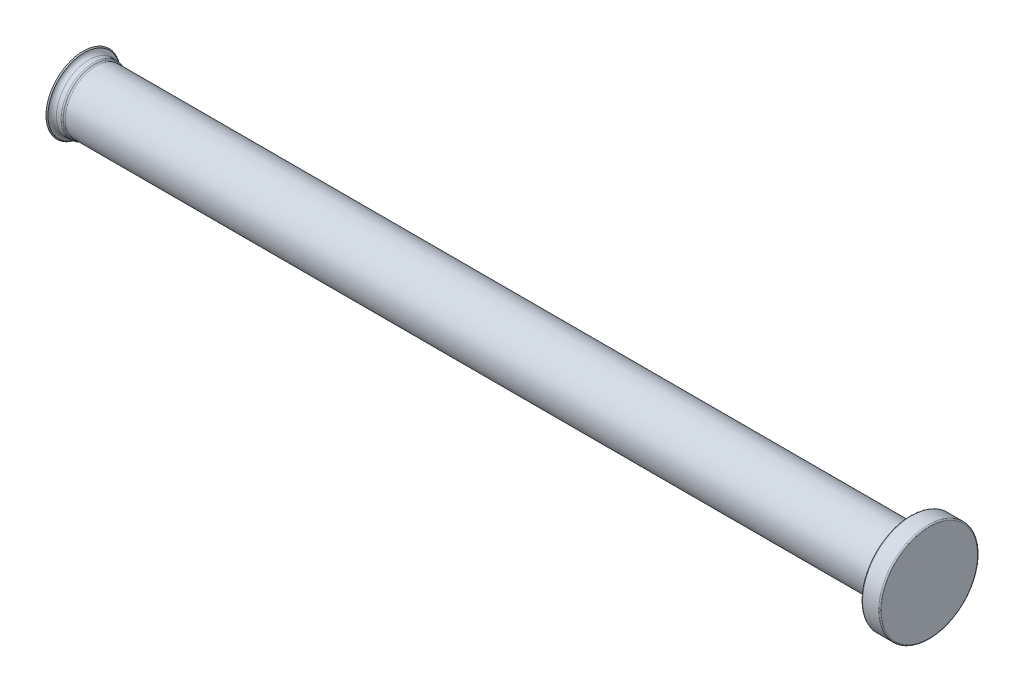
ISO-10303-21;
HEADER;
FILE_DESCRIPTION(('STEP AP214'),'2;1');
FILE_NAME('part.step','',(''),(''),'','','');
FILE_SCHEMA(('AUTOMOTIVE_DESIGN { 1 0 10303 214 1 1 1 1 }'));
ENDSEC;
DATA;
#1=APPLICATION_CONTEXT('core data for automotive mechanical design processes');
#2=APPLICATION_PROTOCOL_DEFINITION('international standard','automotive_design',2000,#1);
#3=PRODUCT_CONTEXT('',#1,'mechanical');
#4=PRODUCT('Part','Part','',(#3));
#5=PRODUCT_RELATED_PRODUCT_CATEGORY('part','',(#4));
#6=PRODUCT_DEFINITION_FORMATION('','',#4);
#7=PRODUCT_DEFINITION_CONTEXT('part definition',#1,'design');
#8=PRODUCT_DEFINITION('design','',#6,#7);
#9=PRODUCT_DEFINITION_SHAPE('','',#8);
#10=(LENGTH_UNIT() NAMED_UNIT(*) SI_UNIT(.MILLI.,.METRE.));
#11=(NAMED_UNIT(*) PLANE_ANGLE_UNIT() SI_UNIT($,.RADIAN.));
#12=(NAMED_UNIT(*) SI_UNIT($,.STERADIAN.) SOLID_ANGLE_UNIT());
#13=UNCERTAINTY_MEASURE_WITH_UNIT(LENGTH_MEASURE(1.E-05),#10,'distance_accuracy_value','');
#14=(GEOMETRIC_REPRESENTATION_CONTEXT(3) GLOBAL_UNCERTAINTY_ASSIGNED_CONTEXT((#13)) GLOBAL_UNIT_ASSIGNED_CONTEXT((#10,
#11,#12)) REPRESENTATION_CONTEXT('',''));
#15=CARTESIAN_POINT('',(0.,0.,0.));
#16=DIRECTION('',(0.,0.,1.));
#17=DIRECTION('',(1.,0.,0.));
#18=AXIS2_PLACEMENT_3D('',#15,#16,#17);
#19=CARTESIAN_POINT('',(-68.,0.,0.));
#20=DIRECTION('',(-1.,0.,0.));
#21=DIRECTION('',(0.,0.,1.));
#22=AXIS2_PLACEMENT_3D('',#19,#20,#21);
#23=TOROIDAL_SURFACE('',#22,3.02521947805027,0.52521947805027);
#24=CARTESIAN_POINT('',(-68.,0.,0.));
#25=DIRECTION('',(-1.,0.,0.));
#26=DIRECTION('',(0.,0.,1.));
#27=AXIS2_PLACEMENT_3D('',#24,#25,#26);
#28=CIRCLE('',#27,2.5);
#29=CARTESIAN_POINT('',(-68.,0.,2.5));
#30=VERTEX_POINT('',#29);
#31=EDGE_CURVE('E80',#30,#30,#28,.T.);
#32=ORIENTED_EDGE('',*,*,#31,.F.);
#33=EDGE_LOOP('',(#32));
#34=FACE_BOUND('',#33,.T.);
#35=CARTESIAN_POINT('',(-68.5081443533099,0.,0.));
#36=DIRECTION('',(-1.,0.,0.));
#37=DIRECTION('',(0.,0.,1.));
#38=AXIS2_PLACEMENT_3D('',#35,#36,#37);
#39=CIRCLE('',#38,2.89238568595394);
#40=CARTESIAN_POINT('',(-68.5081443533099,0.,2.89238568595394));
#41=VERTEX_POINT('',#40);
#42=EDGE_CURVE('E11',#41,#41,#39,.T.);
#43=ORIENTED_EDGE('',*,*,#42,.T.);
#44=EDGE_LOOP('',(#43));
#45=FACE_BOUND('',#44,.T.);
#46=ADVANCED_FACE('F43',(#34,#45),#23,.T.);
#47=CARTESIAN_POINT('',(-68.4715621559245,0.,0.));
#48=DIRECTION('',(1.,0.,0.));
#49=DIRECTION('',(0.,0.,-1.));
#50=AXIS2_PLACEMENT_3D('',#47,#48,#49);
#51=CONICAL_SURFACE('',#50,3.,1.24311337407207);
#52=ORIENTED_EDGE('',*,*,#42,.F.);
#53=EDGE_LOOP('',(#52));
#54=FACE_BOUND('',#53,.T.);
#55=CARTESIAN_POINT('',(-68.4715621559245,0.,0.));
#56=DIRECTION('',(-1.,0.,0.));
#57=DIRECTION('',(0.,0.,1.));
#58=AXIS2_PLACEMENT_3D('',#55,#56,#57);
#59=CIRCLE('',#58,3.);
#60=CARTESIAN_POINT('',(-68.4715621559245,0.,3.));
#61=VERTEX_POINT('',#60);
#62=EDGE_CURVE('E49',#61,#61,#59,.T.);
#63=ORIENTED_EDGE('',*,*,#62,.T.);
#64=EDGE_LOOP('',(#63));
#65=FACE_BOUND('',#64,.T.);
#66=ADVANCED_FACE('F87',(#54,#65),#51,.T.);
#67=CARTESIAN_POINT('',(-68.3869958175932,0.,0.));
#68=DIRECTION('',(-1.,0.,0.));
#69=DIRECTION('',(0.,0.,1.));
#70=AXIS2_PLACEMENT_3D('',#67,#68,#69);
#71=CONICAL_SURFACE('',#70,2.92405507143729,0.731737549159094);
#72=ORIENTED_EDGE('',*,*,#62,.F.);
#73=EDGE_LOOP('',(#72));
#74=FACE_BOUND('',#73,.T.);
#75=CARTESIAN_POINT('',(-68.3869958175932,0.,0.));
#76=DIRECTION('',(-1.,0.,0.));
#77=DIRECTION('',(0.,0.,1.));
#78=AXIS2_PLACEMENT_3D('',#75,#76,#77);
#79=CIRCLE('',#78,2.92405507143729);
#80=CARTESIAN_POINT('',(-68.3869958175932,0.,2.92405507143729));
#81=VERTEX_POINT('',#80);
#82=EDGE_CURVE('E53',#81,#81,#79,.T.);
#83=ORIENTED_EDGE('',*,*,#82,.T.);
#84=EDGE_LOOP('',(#83));
#85=FACE_BOUND('',#84,.T.);
#86=ADVANCED_FACE('F91',(#74,#85),#71,.T.);
#87=CARTESIAN_POINT('',(-68.,0.,0.));
#88=DIRECTION('',(-1.,0.,0.));
#89=DIRECTION('',(0.,0.,1.));
#90=AXIS2_PLACEMENT_3D('',#87,#88,#89);
#91=TOROIDAL_SURFACE('',#90,3.02521947805027,0.399999999999998);
#92=ORIENTED_EDGE('',*,*,#82,.F.);
#93=EDGE_LOOP('',(#92));
#94=FACE_BOUND('',#93,.T.);
#95=CARTESIAN_POINT('',(-68.,0.,0.));
#96=DIRECTION('',(-1.,0.,0.));
#97=DIRECTION('',(0.,0.,1.));
#98=AXIS2_PLACEMENT_3D('',#95,#96,#97);
#99=CIRCLE('',#98,2.62521947805027);
#100=CARTESIAN_POINT('',(-68.,0.,2.62521947805027));
#101=VERTEX_POINT('',#100);
#102=EDGE_CURVE('E57',#101,#101,#99,.T.);
#103=ORIENTED_EDGE('',*,*,#102,.T.);
#104=EDGE_LOOP('',(#103));
#105=FACE_BOUND('',#104,.T.);
#106=ADVANCED_FACE('F96',(#94,#105),#91,.F.);
#107=CARTESIAN_POINT('',(-67.5,0.,0.));
#108=DIRECTION('',(-1.,0.,0.));
#109=DIRECTION('',(0.,0.,1.));
#110=AXIS2_PLACEMENT_3D('',#107,#108,#109);
#111=CYLINDRICAL_SURFACE('',#110,2.62521947805027);
#112=ORIENTED_EDGE('',*,*,#102,.F.);
#113=EDGE_LOOP('',(#112));
#114=FACE_BOUND('',#113,.T.);
#115=CARTESIAN_POINT('',(-67.6252194666853,0.,0.));
#116=DIRECTION('',(-1.,0.,0.));
#117=DIRECTION('',(0.,0.,1.));
#118=AXIS2_PLACEMENT_3D('',#115,#116,#117);
#119=CIRCLE('',#118,2.62521947805027);
#120=CARTESIAN_POINT('',(-67.6252194666853,0.,2.62521947805027));
#121=VERTEX_POINT('',#120);
#122=EDGE_CURVE('E62',#121,#121,#119,.T.);
#123=ORIENTED_EDGE('',*,*,#122,.T.);
#124=EDGE_LOOP('',(#123));
#125=FACE_BOUND('',#124,.T.);
#126=ADVANCED_FACE('F102',(#114,#125),#111,.T.);
#127=CARTESIAN_POINT('',(-67.6252194666853,0.,0.));
#128=DIRECTION('',(-1.,0.,0.));
#129=DIRECTION('',(0.,0.,1.));
#130=AXIS2_PLACEMENT_3D('',#127,#128,#129);
#131=TOROIDAL_SURFACE('',#130,2.50000001136495,0.125219466685321);
#132=ORIENTED_EDGE('',*,*,#122,.F.);
#133=EDGE_LOOP('',(#132));
#134=FACE_BOUND('',#133,.T.);
#135=CARTESIAN_POINT('',(-67.5167762242067,0.,0.));
#136=DIRECTION('',(-1.,0.,0.));
#137=DIRECTION('',(0.,0.,1.));
#138=AXIS2_PLACEMENT_3D('',#135,#136,#137);
#139=CIRCLE('',#138,2.56260973902513);
#140=CARTESIAN_POINT('',(-67.5167762242067,0.,2.56260973902513));
#141=VERTEX_POINT('',#140);
#142=EDGE_CURVE('E65',#141,#141,#139,.T.);
#143=ORIENTED_EDGE('',*,*,#142,.T.);
#144=EDGE_LOOP('',(#143));
#145=FACE_BOUND('',#144,.T.);
#146=ADVANCED_FACE('F106',(#134,#145),#131,.T.);
#147=CARTESIAN_POINT('',(-67.4083329817281,0.,0.));
#148=DIRECTION('',(-1.,0.,0.));
#149=DIRECTION('',(0.,0.,1.));
#150=AXIS2_PLACEMENT_3D('',#147,#148,#149);
#151=TOROIDAL_SURFACE('',#150,2.62521946668532,0.125219466685323);
#152=ORIENTED_EDGE('',*,*,#142,.F.);
#153=EDGE_LOOP('',(#152));
#154=FACE_BOUND('',#153,.T.);
#155=CARTESIAN_POINT('',(-67.4083329817281,0.,0.));
#156=DIRECTION('',(-1.,0.,0.));
#157=DIRECTION('',(0.,0.,1.));
#158=AXIS2_PLACEMENT_3D('',#155,#156,#157);
#159=CIRCLE('',#158,2.5);
#160=CARTESIAN_POINT('',(-67.4083329817281,0.,2.5));
#161=VERTEX_POINT('',#160);
#162=EDGE_CURVE('E68',#161,#161,#159,.T.);
#163=ORIENTED_EDGE('',*,*,#162,.T.);
#164=EDGE_LOOP('',(#163));
#165=FACE_BOUND('',#164,.T.);
#166=ADVANCED_FACE('F110',(#154,#165),#151,.F.);
#167=CARTESIAN_POINT('',(-67.4083329817281,2.5,0.));
#168=DIRECTION('',(-1.,0.,0.));
#169=DIRECTION('',(0.,0.,1.));
#170=AXIS2_PLACEMENT_3D('',#167,#168,#169);
#171=PLANE('',#170);
#172=ORIENTED_EDGE('',*,*,#162,.F.);
#173=EDGE_LOOP('',(#172));
#174=FACE_BOUND('',#173,.T.);
#175=CARTESIAN_POINT('',(-67.4083329817281,0.,0.));
#176=DIRECTION('',(-1.,0.,0.));
#177=DIRECTION('',(0.,0.,1.));
#178=AXIS2_PLACEMENT_3D('',#175,#176,#177);
#179=CIRCLE('',#178,2.00059573308664);
#180=CARTESIAN_POINT('',(-67.4083329817281,0.,2.00059573308664));
#181=VERTEX_POINT('',#180);
#182=EDGE_CURVE('E71',#181,#181,#179,.T.);
#183=ORIENTED_EDGE('',*,*,#182,.T.);
#184=EDGE_LOOP('',(#183));
#185=FACE_BOUND('',#184,.T.);
#186=ADVANCED_FACE('F114',(#174,#185),#171,.F.);
#187=CARTESIAN_POINT('',(-67.5,0.,0.));
#188=DIRECTION('',(-1.,0.,0.));
#189=DIRECTION('',(0.,0.,1.));
#190=AXIS2_PLACEMENT_3D('',#187,#188,#189);
#191=CONICAL_SURFACE('',#190,2.40261795055891,1.34661420724191);
#192=ORIENTED_EDGE('',*,*,#182,.F.);
#193=EDGE_LOOP('',(#192));
#194=FACE_BOUND('',#193,.T.);
#195=CARTESIAN_POINT('',(-67.5,0.,0.));
#196=DIRECTION('',(-1.,0.,0.));
#197=DIRECTION('',(0.,0.,1.));
#198=AXIS2_PLACEMENT_3D('',#195,#196,#197);
#199=CIRCLE('',#198,2.40261795055891);
#200=CARTESIAN_POINT('',(-67.5,0.,2.40261795055891));
#201=VERTEX_POINT('',#200);
#202=EDGE_CURVE('E74',#201,#201,#199,.T.);
#203=ORIENTED_EDGE('',*,*,#202,.T.);
#204=EDGE_LOOP('',(#203));
#205=FACE_BOUND('',#204,.T.);
#206=ADVANCED_FACE('F118',(#194,#205),#191,.F.);
#207=CARTESIAN_POINT('',(-67.6220860067253,0.,0.));
#208=DIRECTION('',(-1.,0.,0.));
#209=DIRECTION('',(0.,0.,1.));
#210=AXIS2_PLACEMENT_3D('',#207,#208,#209);
#211=TOROIDAL_SURFACE('',#210,2.37478053331467,0.125219466685326);
#212=ORIENTED_EDGE('',*,*,#202,.F.);
#213=EDGE_LOOP('',(#212));
#214=FACE_BOUND('',#213,.T.);
#215=CARTESIAN_POINT('',(-67.6220860067253,0.,0.));
#216=DIRECTION('',(-1.,0.,0.));
#217=DIRECTION('',(0.,0.,1.));
#218=AXIS2_PLACEMENT_3D('',#215,#216,#217);
#219=CIRCLE('',#218,2.5);
#220=CARTESIAN_POINT('',(-67.6220860067253,0.,2.5));
#221=VERTEX_POINT('',#220);
#222=EDGE_CURVE('E77',#221,#221,#219,.T.);
#223=ORIENTED_EDGE('',*,*,#222,.T.);
#224=EDGE_LOOP('',(#223));
#225=FACE_BOUND('',#224,.T.);
#226=ADVANCED_FACE('F122',(#214,#225),#211,.F.);
#227=CARTESIAN_POINT('',(-67.5,0.,0.));
#228=DIRECTION('',(-1.,0.,0.));
#229=DIRECTION('',(0.,0.,1.));
#230=AXIS2_PLACEMENT_3D('',#227,#228,#229);
#231=CYLINDRICAL_SURFACE('',#230,2.5);
#232=ORIENTED_EDGE('',*,*,#222,.F.);
#233=EDGE_LOOP('',(#232));
#234=FACE_BOUND('',#233,.T.);
#235=ORIENTED_EDGE('',*,*,#31,.T.);
#236=EDGE_LOOP('',(#235));
#237=FACE_BOUND('',#236,.T.);
#238=ADVANCED_FACE('F84',(#234,#237),#231,.F.);
#239=CLOSED_SHELL('',(#46,#66,#86,#106,#126,#146,#166,#186,#206,#226,#238));
#240=MANIFOLD_SOLID_BREP('B2',#239);
#241=CARTESIAN_POINT('',(0.,0.,0.));
#242=DIRECTION('',(-1.,0.,0.));
#243=DIRECTION('',(0.,0.,1.));
#244=AXIS2_PLACEMENT_3D('',#241,#242,#243);
#245=PLANE('',#244);
#246=CARTESIAN_POINT('',(0.,0.,0.));
#247=DIRECTION('',(-1.,0.,0.));
#248=DIRECTION('',(0.,0.,1.));
#249=AXIS2_PLACEMENT_3D('',#246,#247,#248);
#250=CIRCLE('',#249,3.9);
#251=CARTESIAN_POINT('',(0.,0.,3.9));
#252=VERTEX_POINT('',#251);
#253=EDGE_CURVE('E217',#252,#252,#250,.F.);
#254=ORIENTED_EDGE('',*,*,#253,.T.);
#255=EDGE_LOOP('',(#254));
#256=FACE_BOUND('',#255,.T.);
#257=ADVANCED_FACE('F210',(#256),#245,.F.);
#258=CARTESIAN_POINT('',(0.,0.,0.));
#259=DIRECTION('',(-1.,0.,0.));
#260=DIRECTION('',(0.,0.,1.));
#261=AXIS2_PLACEMENT_3D('',#258,#259,#260);
#262=CYLINDRICAL_SURFACE('',#261,4.);
#263=CARTESIAN_POINT('',(-0.1,0.,0.));
#264=DIRECTION('',(-1.,0.,0.));
#265=DIRECTION('',(0.,0.,1.));
#266=AXIS2_PLACEMENT_3D('',#263,#264,#265);
#267=CIRCLE('',#266,4.);
#268=CARTESIAN_POINT('',(-0.1,0.,4.));
#269=VERTEX_POINT('',#268);
#270=EDGE_CURVE('E236',#269,#269,#267,.T.);
#271=ORIENTED_EDGE('',*,*,#270,.T.);
#272=EDGE_LOOP('',(#271));
#273=FACE_BOUND('',#272,.T.);
#274=CARTESIAN_POINT('',(-1.4,0.,0.));
#275=DIRECTION('',(1.,0.,0.));
#276=DIRECTION('',(0.,0.,-1.));
#277=AXIS2_PLACEMENT_3D('',#274,#275,#276);
#278=CIRCLE('',#277,4.);
#279=CARTESIAN_POINT('',(-1.4,0.,-4.));
#280=VERTEX_POINT('',#279);
#281=EDGE_CURVE('E231',#280,#280,#278,.T.);
#282=ORIENTED_EDGE('',*,*,#281,.T.);
#283=EDGE_LOOP('',(#282));
#284=FACE_BOUND('',#283,.T.);
#285=ADVANCED_FACE('F248',(#273,#284),#262,.T.);
#286=CARTESIAN_POINT('',(-1.5,4.,0.));
#287=DIRECTION('',(1.,0.,0.));
#288=DIRECTION('',(0.,0.,-1.));
#289=AXIS2_PLACEMENT_3D('',#286,#287,#288);
#290=PLANE('',#289);
#291=CARTESIAN_POINT('',(-1.5,0.,0.));
#292=DIRECTION('',(1.,0.,0.));
#293=DIRECTION('',(0.,0.,-1.));
#294=AXIS2_PLACEMENT_3D('',#291,#292,#293);
#295=CIRCLE('',#294,3.9);
#296=CARTESIAN_POINT('',(-1.5,0.,-3.9));
#297=VERTEX_POINT('',#296);
#298=EDGE_CURVE('E41',#297,#297,#295,.F.);
#299=ORIENTED_EDGE('',*,*,#298,.T.);
#300=EDGE_LOOP('',(#299));
#301=FACE_BOUND('',#300,.T.);
#302=CARTESIAN_POINT('',(-1.5,0.,0.));
#303=DIRECTION('',(-1.,0.,0.));
#304=DIRECTION('',(0.,0.,1.));
#305=AXIS2_PLACEMENT_3D('',#302,#303,#304);
#306=CIRCLE('',#305,2.5);
#307=CARTESIAN_POINT('',(-1.5,0.,2.5));
#308=VERTEX_POINT('',#307);
#309=EDGE_CURVE('E228',#308,#308,#306,.T.);
#310=ORIENTED_EDGE('',*,*,#309,.F.);
#311=EDGE_LOOP('',(#310));
#312=FACE_BOUND('',#311,.T.);
#313=ADVANCED_FACE('F251',(#301,#312),#290,.F.);
#314=CARTESIAN_POINT('',(0.,0.,0.));
#315=DIRECTION('',(-1.,0.,0.));
#316=DIRECTION('',(0.,0.,1.));
#317=AXIS2_PLACEMENT_3D('',#314,#315,#316);
#318=CYLINDRICAL_SURFACE('',#317,2.5);
#319=CARTESIAN_POINT('',(-67.5,0.,0.));
#320=DIRECTION('',(-1.,0.,0.));
#321=DIRECTION('',(0.,0.,1.));
#322=AXIS2_PLACEMENT_3D('',#319,#320,#321);
#323=CIRCLE('',#322,2.49999999999999);
#324=CARTESIAN_POINT('',(-67.5,0.,2.49999999999999));
#325=VERTEX_POINT('',#324);
#326=EDGE_CURVE('E226',#325,#325,#323,.T.);
#327=ORIENTED_EDGE('',*,*,#326,.F.);
#328=EDGE_LOOP('',(#327));
#329=FACE_BOUND('',#328,.T.);
#330=ORIENTED_EDGE('',*,*,#309,.T.);
#331=EDGE_LOOP('',(#330));
#332=FACE_BOUND('',#331,.T.);
#333=ADVANCED_FACE('F245',(#329,#332),#318,.T.);
#334=CARTESIAN_POINT('',(-0.1,0.,0.));
#335=DIRECTION('',(-1.,0.,0.));
#336=DIRECTION('',(0.,0.,1.));
#337=AXIS2_PLACEMENT_3D('',#334,#335,#336);
#338=TOROIDAL_SURFACE('',#337,3.9,0.1);
#339=ORIENTED_EDGE('',*,*,#253,.F.);
#340=EDGE_LOOP('',(#339));
#341=FACE_BOUND('',#340,.T.);
#342=ORIENTED_EDGE('',*,*,#270,.F.);
#343=EDGE_LOOP('',(#342));
#344=FACE_BOUND('',#343,.T.);
#345=ADVANCED_FACE('F242',(#341,#344),#338,.T.);
#346=CARTESIAN_POINT('',(-1.4,0.,0.));
#347=DIRECTION('',(1.,0.,0.));
#348=DIRECTION('',(0.,0.,-1.));
#349=AXIS2_PLACEMENT_3D('',#346,#347,#348);
#350=TOROIDAL_SURFACE('',#349,3.9,0.1);
#351=ORIENTED_EDGE('',*,*,#281,.F.);
#352=EDGE_LOOP('',(#351));
#353=FACE_BOUND('',#352,.T.);
#354=ORIENTED_EDGE('',*,*,#298,.F.);
#355=EDGE_LOOP('',(#354));
#356=FACE_BOUND('',#355,.T.);
#357=ADVANCED_FACE('F212',(#353,#356),#350,.T.);
#358=CARTESIAN_POINT('',(-67.5,0.,0.));
#359=DIRECTION('',(-1.,0.,0.));
#360=DIRECTION('',(0.,0.,1.));
#361=AXIS2_PLACEMENT_3D('',#358,#359,#360);
#362=CONICAL_SURFACE('',#361,2.49999999999999,1.39626340159547);
#363=CARTESIAN_POINT('',(-67.0591825482288,0.,0.));
#364=VERTEX_POINT('',#363);
#365=VERTEX_LOOP('',#364);
#366=FACE_BOUND('',#365,.T.);
#367=ORIENTED_EDGE('',*,*,#326,.T.);
#368=EDGE_LOOP('',(#367));
#369=FACE_BOUND('',#368,.T.);
#370=ADVANCED_FACE('F220',(#366,#369),#362,.F.);
#371=CLOSED_SHELL('',(#257,#285,#313,#333,#345,#357,#370));
#372=MANIFOLD_SOLID_BREP('B6',#371);
#373=ADVANCED_BREP_SHAPE_REPRESENTATION('',(#18,#240,#372),#14);
#374=SHAPE_DEFINITION_REPRESENTATION(#9,#373);
ENDSEC;
END-ISO-10303-21;
